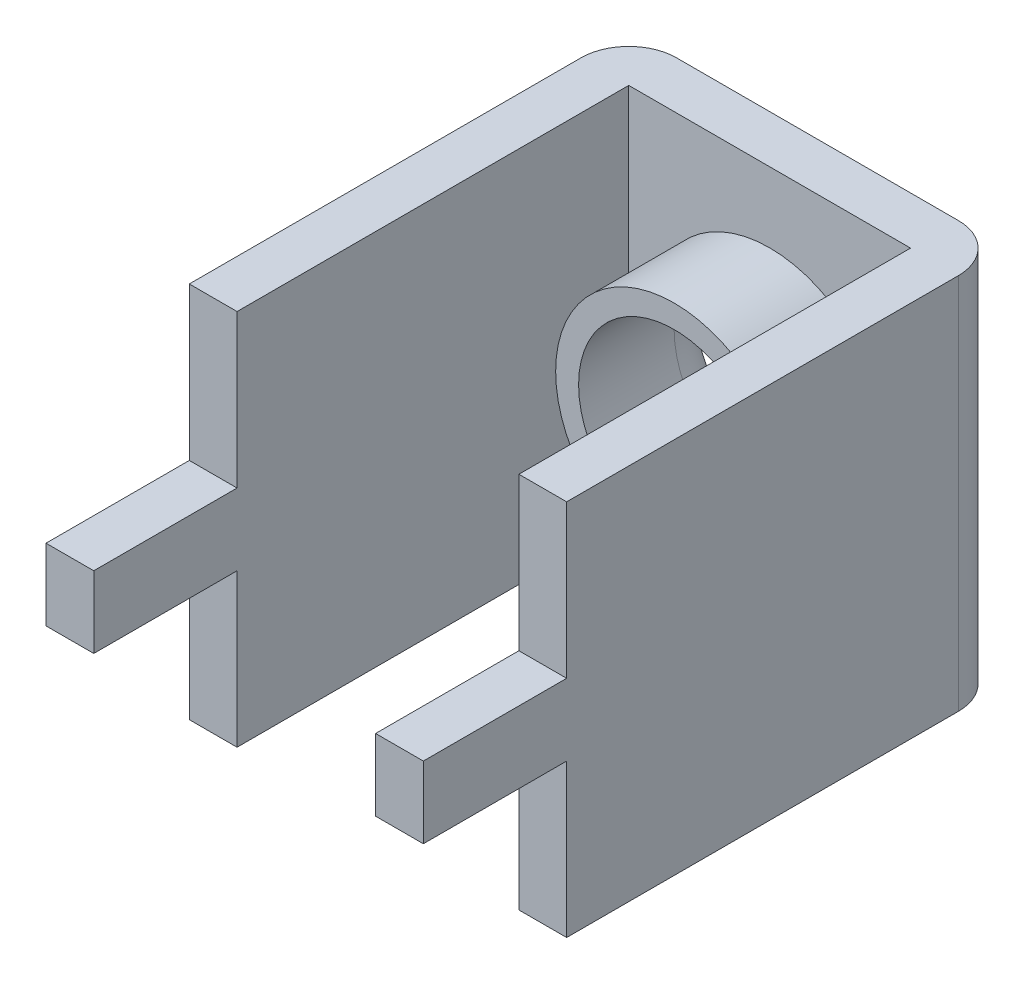
ISO-10303-21;
HEADER;
FILE_DESCRIPTION(('STEP AP214'),'2;1');
FILE_NAME('part.step','',(''),(''),'','','');
FILE_SCHEMA(('AUTOMOTIVE_DESIGN { 1 0 10303 214 1 1 1 1 }'));
ENDSEC;
DATA;
#1=APPLICATION_CONTEXT('core data for automotive mechanical design processes');
#2=APPLICATION_PROTOCOL_DEFINITION('international standard','automotive_design',2000,#1);
#3=PRODUCT_CONTEXT('',#1,'mechanical');
#4=PRODUCT('Part','Part','',(#3));
#5=PRODUCT_RELATED_PRODUCT_CATEGORY('part','',(#4));
#6=PRODUCT_DEFINITION_FORMATION('','',#4);
#7=PRODUCT_DEFINITION_CONTEXT('part definition',#1,'design');
#8=PRODUCT_DEFINITION('design','',#6,#7);
#9=PRODUCT_DEFINITION_SHAPE('','',#8);
#10=(LENGTH_UNIT() NAMED_UNIT(*) SI_UNIT(.MILLI.,.METRE.));
#11=(NAMED_UNIT(*) PLANE_ANGLE_UNIT() SI_UNIT($,.RADIAN.));
#12=(NAMED_UNIT(*) SI_UNIT($,.STERADIAN.) SOLID_ANGLE_UNIT());
#13=UNCERTAINTY_MEASURE_WITH_UNIT(LENGTH_MEASURE(1.E-05),#10,'distance_accuracy_value','');
#14=(GEOMETRIC_REPRESENTATION_CONTEXT(3) GLOBAL_UNCERTAINTY_ASSIGNED_CONTEXT((#13)) GLOBAL_UNIT_ASSIGNED_CONTEXT((#10,
#11,#12)) REPRESENTATION_CONTEXT('',''));
#15=CARTESIAN_POINT('',(0.,0.,0.));
#16=DIRECTION('',(0.,0.,1.));
#17=DIRECTION('',(1.,0.,0.));
#18=AXIS2_PLACEMENT_3D('',#15,#16,#17);
#19=CARTESIAN_POINT('',(0.,0.,0.));
#20=DIRECTION('',(0.,0.,-1.));
#21=DIRECTION('',(-1.,0.,0.));
#22=AXIS2_PLACEMENT_3D('',#19,#20,#21);
#23=PLANE('',#22);
#24=CARTESIAN_POINT('',(0.,0.,0.));
#25=DIRECTION('',(0.,0.,-1.));
#26=DIRECTION('',(-1.,0.,0.));
#27=AXIS2_PLACEMENT_3D('',#24,#25,#26);
#28=CIRCLE('',#27,3.);
#29=CARTESIAN_POINT('',(-2.95,-0.545435605731788,0.));
#30=VERTEX_POINT('',#29);
#31=CARTESIAN_POINT('',(2.95,-0.545435605731779,0.));
#32=VERTEX_POINT('',#31);
#33=EDGE_CURVE('E371',#30,#32,#28,.F.);
#34=ORIENTED_EDGE('',*,*,#33,.T.);
#35=DIRECTION('',(0.,1.,0.));
#36=VECTOR('',#35,1.);
#37=CARTESIAN_POINT('',(2.95,-3.95,0.));
#38=LINE('',#37,#36);
#39=CARTESIAN_POINT('',(2.95,-3.95,0.));
#40=VERTEX_POINT('',#39);
#41=EDGE_CURVE('E375',#32,#40,#38,.F.);
#42=ORIENTED_EDGE('',*,*,#41,.T.);
#43=DIRECTION('',(1.,0.,0.));
#44=VECTOR('',#43,1.);
#45=CARTESIAN_POINT('',(-3.95,-3.95,0.));
#46=LINE('',#45,#44);
#47=CARTESIAN_POINT('',(-2.95,-3.95,0.));
#48=VERTEX_POINT('',#47);
#49=EDGE_CURVE('E336',#48,#40,#46,.T.);
#50=ORIENTED_EDGE('',*,*,#49,.F.);
#51=DIRECTION('',(0.,-1.,0.));
#52=VECTOR('',#51,1.);
#53=CARTESIAN_POINT('',(-2.95,3.95,0.));
#54=LINE('',#53,#52);
#55=EDGE_CURVE('E368',#48,#30,#54,.F.);
#56=ORIENTED_EDGE('',*,*,#55,.T.);
#57=EDGE_LOOP('',(#34,#42,#50,#56));
#58=FACE_BOUND('',#57,.T.);
#59=ADVANCED_FACE('F47',(#58),#23,.T.);
#60=CARTESIAN_POINT('',(0.,0.,1.));
#61=DIRECTION('',(0.,0.,-1.));
#62=DIRECTION('',(-1.,0.,0.));
#63=AXIS2_PLACEMENT_3D('',#60,#61,#62);
#64=PLANE('',#63);
#65=DIRECTION('',(0.,-1.,0.));
#66=VECTOR('',#65,1.);
#67=CARTESIAN_POINT('',(2.95,0.,1.));
#68=LINE('',#67,#66);
#69=CARTESIAN_POINT('',(2.95,3.95,1.));
#70=VERTEX_POINT('',#69);
#71=CARTESIAN_POINT('',(2.95,-3.95,1.));
#72=VERTEX_POINT('',#71);
#73=EDGE_CURVE('E300',#70,#72,#68,.T.);
#74=ORIENTED_EDGE('',*,*,#73,.F.);
#75=DIRECTION('',(-1.,0.,0.));
#76=VECTOR('',#75,1.);
#77=CARTESIAN_POINT('',(-3.95,3.95,1.));
#78=LINE('',#77,#76);
#79=CARTESIAN_POINT('',(-2.95,3.95,1.));
#80=VERTEX_POINT('',#79);
#81=EDGE_CURVE('E332',#70,#80,#78,.T.);
#82=ORIENTED_EDGE('',*,*,#81,.T.);
#83=DIRECTION('',(0.,1.,0.));
#84=VECTOR('',#83,1.);
#85=CARTESIAN_POINT('',(-2.95,0.,1.));
#86=LINE('',#85,#84);
#87=CARTESIAN_POINT('',(-2.95,-3.95,1.));
#88=VERTEX_POINT('',#87);
#89=EDGE_CURVE('E327',#88,#80,#86,.T.);
#90=ORIENTED_EDGE('',*,*,#89,.F.);
#91=DIRECTION('',(1.,0.,0.));
#92=VECTOR('',#91,1.);
#93=CARTESIAN_POINT('',(-3.95,-3.95,1.));
#94=LINE('',#93,#92);
#95=EDGE_CURVE('E335',#88,#72,#94,.T.);
#96=ORIENTED_EDGE('',*,*,#95,.T.);
#97=EDGE_LOOP('',(#74,#82,#90,#96));
#98=FACE_BOUND('',#97,.T.);
#99=CARTESIAN_POINT('',(0.,0.,1.));
#100=DIRECTION('',(0.,0.,-1.));
#101=DIRECTION('',(-1.,0.,0.));
#102=AXIS2_PLACEMENT_3D('',#99,#100,#101);
#103=CIRCLE('',#102,2.48021202687764);
#104=CARTESIAN_POINT('',(-2.48021202687764,0.,1.));
#105=VERTEX_POINT('',#104);
#106=EDGE_CURVE('E355',#105,#105,#103,.F.);
#107=ORIENTED_EDGE('',*,*,#106,.F.);
#108=EDGE_LOOP('',(#107));
#109=FACE_BOUND('',#108,.T.);
#110=ADVANCED_FACE('F422',(#98,#109),#64,.F.);
#111=CARTESIAN_POINT('',(0.,0.,9.2));
#112=DIRECTION('',(0.,0.,-1.));
#113=DIRECTION('',(-1.,0.,0.));
#114=AXIS2_PLACEMENT_3D('',#111,#112,#113);
#115=PLANE('',#114);
#116=DIRECTION('',(-1.,0.,0.));
#117=VECTOR('',#116,1.);
#118=CARTESIAN_POINT('',(3.95,0.750000000000001,9.2));
#119=LINE('',#118,#117);
#120=CARTESIAN_POINT('',(3.95,0.750000000000001,9.2));
#121=VERTEX_POINT('',#120);
#122=CARTESIAN_POINT('',(2.95,0.750000000000002,9.2));
#123=VERTEX_POINT('',#122);
#124=EDGE_CURVE('E209',#121,#123,#119,.T.);
#125=ORIENTED_EDGE('',*,*,#124,.F.);
#126=DIRECTION('',(0.,1.,0.));
#127=VECTOR('',#126,1.);
#128=CARTESIAN_POINT('',(3.95,3.95,9.2));
#129=LINE('',#128,#127);
#130=CARTESIAN_POINT('',(3.95,3.95,9.2));
#131=VERTEX_POINT('',#130);
#132=EDGE_CURVE('E192',#121,#131,#129,.T.);
#133=ORIENTED_EDGE('',*,*,#132,.T.);
#134=DIRECTION('',(-1.,0.,0.));
#135=VECTOR('',#134,1.);
#136=CARTESIAN_POINT('',(3.95,3.95,9.2));
#137=LINE('',#136,#135);
#138=CARTESIAN_POINT('',(2.95,3.95,9.2));
#139=VERTEX_POINT('',#138);
#140=EDGE_CURVE('E206',#131,#139,#137,.T.);
#141=ORIENTED_EDGE('',*,*,#140,.T.);
#142=DIRECTION('',(0.,-1.,0.));
#143=VECTOR('',#142,1.);
#144=CARTESIAN_POINT('',(2.95,3.95,9.2));
#145=LINE('',#144,#143);
#146=EDGE_CURVE('E212',#139,#123,#145,.T.);
#147=ORIENTED_EDGE('',*,*,#146,.T.);
#148=EDGE_LOOP('',(#125,#133,#141,#147));
#149=FACE_BOUND('',#148,.T.);
#150=ADVANCED_FACE('F210',(#149),#115,.F.);
#151=DIRECTION('',(1.,0.,0.));
#152=VECTOR('',#151,1.);
#153=CARTESIAN_POINT('',(2.95,-0.75,9.2));
#154=LINE('',#153,#152);
#155=CARTESIAN_POINT('',(2.95,-0.749999999999999,9.2));
#156=VERTEX_POINT('',#155);
#157=CARTESIAN_POINT('',(3.95,-0.749999999999999,9.2));
#158=VERTEX_POINT('',#157);
#159=EDGE_CURVE('E218',#156,#158,#154,.T.);
#160=ORIENTED_EDGE('',*,*,#159,.F.);
#161=CARTESIAN_POINT('',(2.95,-3.95,9.2));
#162=VERTEX_POINT('',#161);
#163=EDGE_CURVE('E294',#156,#162,#145,.T.);
#164=ORIENTED_EDGE('',*,*,#163,.T.);
#165=DIRECTION('',(1.,0.,0.));
#166=VECTOR('',#165,1.);
#167=CARTESIAN_POINT('',(3.95,-3.95,9.2));
#168=LINE('',#167,#166);
#169=CARTESIAN_POINT('',(3.95,-3.95,9.2));
#170=VERTEX_POINT('',#169);
#171=EDGE_CURVE('E290',#162,#170,#168,.T.);
#172=ORIENTED_EDGE('',*,*,#171,.T.);
#173=EDGE_CURVE('E205',#170,#158,#129,.T.);
#174=ORIENTED_EDGE('',*,*,#173,.T.);
#175=EDGE_LOOP('',(#160,#164,#172,#174));
#176=FACE_BOUND('',#175,.T.);
#177=ADVANCED_FACE('F540',(#176),#115,.F.);
#178=CARTESIAN_POINT('',(0.,0.,9.2));
#179=DIRECTION('',(0.,0.,1.));
#180=DIRECTION('',(1.,0.,0.));
#181=AXIS2_PLACEMENT_3D('',#178,#179,#180);
#182=PLANE('',#181);
#183=DIRECTION('',(0.,-1.,0.));
#184=VECTOR('',#183,1.);
#185=CARTESIAN_POINT('',(-3.95,3.95,9.2));
#186=LINE('',#185,#184);
#187=CARTESIAN_POINT('',(-3.95,3.95,9.2));
#188=VERTEX_POINT('',#187);
#189=CARTESIAN_POINT('',(-3.95,0.750000000000001,9.2));
#190=VERTEX_POINT('',#189);
#191=EDGE_CURVE('E305',#188,#190,#186,.T.);
#192=ORIENTED_EDGE('',*,*,#191,.T.);
#193=DIRECTION('',(-1.,0.,0.));
#194=VECTOR('',#193,1.);
#195=CARTESIAN_POINT('',(-3.95,0.75,9.2));
#196=LINE('',#195,#194);
#197=CARTESIAN_POINT('',(-2.95,0.75,9.2));
#198=VERTEX_POINT('',#197);
#199=EDGE_CURVE('E217',#198,#190,#196,.T.);
#200=ORIENTED_EDGE('',*,*,#199,.F.);
#201=DIRECTION('',(0.,1.,0.));
#202=VECTOR('',#201,1.);
#203=CARTESIAN_POINT('',(-2.95,3.95,9.2));
#204=LINE('',#203,#202);
#205=CARTESIAN_POINT('',(-2.95,3.95,9.2));
#206=VERTEX_POINT('',#205);
#207=EDGE_CURVE('E311',#198,#206,#204,.T.);
#208=ORIENTED_EDGE('',*,*,#207,.T.);
#209=DIRECTION('',(-1.,0.,0.));
#210=VECTOR('',#209,1.);
#211=CARTESIAN_POINT('',(-3.95,3.95,9.2));
#212=LINE('',#211,#210);
#213=EDGE_CURVE('E315',#206,#188,#212,.T.);
#214=ORIENTED_EDGE('',*,*,#213,.T.);
#215=EDGE_LOOP('',(#192,#200,#208,#214));
#216=FACE_BOUND('',#215,.T.);
#217=ADVANCED_FACE('F440',(#216),#182,.T.);
#218=CARTESIAN_POINT('',(-2.95,-3.95,9.2));
#219=VERTEX_POINT('',#218);
#220=CARTESIAN_POINT('',(-2.95,-0.75,9.2));
#221=VERTEX_POINT('',#220);
#222=EDGE_CURVE('E312',#219,#221,#204,.T.);
#223=ORIENTED_EDGE('',*,*,#222,.T.);
#224=DIRECTION('',(1.,0.,0.));
#225=VECTOR('',#224,1.);
#226=CARTESIAN_POINT('',(-2.95,-0.75,9.2));
#227=LINE('',#226,#225);
#228=CARTESIAN_POINT('',(-3.95,-0.75,9.2));
#229=VERTEX_POINT('',#228);
#230=EDGE_CURVE('E251',#229,#221,#227,.T.);
#231=ORIENTED_EDGE('',*,*,#230,.F.);
#232=CARTESIAN_POINT('',(-3.95,-3.95,9.2));
#233=VERTEX_POINT('',#232);
#234=EDGE_CURVE('E304',#229,#233,#186,.T.);
#235=ORIENTED_EDGE('',*,*,#234,.T.);
#236=DIRECTION('',(1.,0.,0.));
#237=VECTOR('',#236,1.);
#238=CARTESIAN_POINT('',(-3.95,-3.95,9.2));
#239=LINE('',#238,#237);
#240=EDGE_CURVE('E308',#233,#219,#239,.T.);
#241=ORIENTED_EDGE('',*,*,#240,.T.);
#242=EDGE_LOOP('',(#223,#231,#235,#241));
#243=FACE_BOUND('',#242,.T.);
#244=ADVANCED_FACE('F433',(#243),#182,.T.);
#245=DIRECTION('',(-1.,0.,0.));
#246=VECTOR('',#245,1.);
#247=CARTESIAN_POINT('',(-3.95,3.95,0.));
#248=LINE('',#247,#246);
#249=CARTESIAN_POINT('',(2.95,3.95,0.));
#250=VERTEX_POINT('',#249);
#251=CARTESIAN_POINT('',(-2.95,3.95,0.));
#252=VERTEX_POINT('',#251);
#253=EDGE_CURVE('E331',#250,#252,#248,.T.);
#254=ORIENTED_EDGE('',*,*,#253,.F.);
#255=DIRECTION('',(0.,1.,0.));
#256=VECTOR('',#255,1.);
#257=CARTESIAN_POINT('',(2.95,-3.95,0.));
#258=LINE('',#257,#256);
#259=CARTESIAN_POINT('',(2.95,0.545435605731781,0.));
#260=VERTEX_POINT('',#259);
#261=EDGE_CURVE('E365',#250,#260,#258,.F.);
#262=ORIENTED_EDGE('',*,*,#261,.T.);
#263=CARTESIAN_POINT('',(0.,0.,0.));
#264=DIRECTION('',(0.,0.,-1.));
#265=DIRECTION('',(-1.,0.,0.));
#266=AXIS2_PLACEMENT_3D('',#263,#264,#265);
#267=CIRCLE('',#266,3.);
#268=CARTESIAN_POINT('',(-2.95,0.54543560573179,0.));
#269=VERTEX_POINT('',#268);
#270=EDGE_CURVE('E362',#260,#269,#267,.F.);
#271=ORIENTED_EDGE('',*,*,#270,.T.);
#272=DIRECTION('',(0.,-1.,0.));
#273=VECTOR('',#272,1.);
#274=CARTESIAN_POINT('',(-2.95,3.95,0.));
#275=LINE('',#274,#273);
#276=EDGE_CURVE('E359',#269,#252,#275,.F.);
#277=ORIENTED_EDGE('',*,*,#276,.T.);
#278=EDGE_LOOP('',(#254,#262,#271,#277));
#279=FACE_BOUND('',#278,.T.);
#280=ADVANCED_FACE('F425',(#279),#23,.T.);
#281=CARTESIAN_POINT('',(3.95,-3.95,1.));
#282=DIRECTION('',(-1.,0.,0.));
#283=DIRECTION('',(0.,0.,1.));
#284=AXIS2_PLACEMENT_3D('',#281,#282,#283);
#285=PLANE('',#284);
#286=DIRECTION('',(0.,0.,-1.));
#287=VECTOR('',#286,1.);
#288=CARTESIAN_POINT('',(3.95,-3.95,1.));
#289=LINE('',#288,#287);
#290=CARTESIAN_POINT('',(3.95,-3.95,1.));
#291=VERTEX_POINT('',#290);
#292=EDGE_CURVE('E339',#170,#291,#289,.T.);
#293=ORIENTED_EDGE('',*,*,#292,.T.);
#294=DIRECTION('',(0.,1.,0.));
#295=VECTOR('',#294,1.);
#296=CARTESIAN_POINT('',(3.95,3.95,1.));
#297=LINE('',#296,#295);
#298=CARTESIAN_POINT('',(3.95,3.95,1.));
#299=VERTEX_POINT('',#298);
#300=EDGE_CURVE('E382',#291,#299,#297,.T.);
#301=ORIENTED_EDGE('',*,*,#300,.T.);
#302=DIRECTION('',(0.,0.,-1.));
#303=VECTOR('',#302,1.);
#304=CARTESIAN_POINT('',(3.95,3.95,1.));
#305=LINE('',#304,#303);
#306=EDGE_CURVE('E201',#131,#299,#305,.T.);
#307=ORIENTED_EDGE('',*,*,#306,.F.);
#308=ORIENTED_EDGE('',*,*,#132,.F.);
#309=DIRECTION('',(0.,0.,-1.));
#310=VECTOR('',#309,1.);
#311=CARTESIAN_POINT('',(3.95,0.750000000000001,12.2));
#312=LINE('',#311,#310);
#313=CARTESIAN_POINT('',(3.95,0.750000000000001,12.2));
#314=VERTEX_POINT('',#313);
#315=EDGE_CURVE('E198',#314,#121,#312,.T.);
#316=ORIENTED_EDGE('',*,*,#315,.F.);
#317=DIRECTION('',(0.,1.,0.));
#318=VECTOR('',#317,1.);
#319=CARTESIAN_POINT('',(3.95,-0.749999999999999,12.2));
#320=LINE('',#319,#318);
#321=CARTESIAN_POINT('',(3.95,-0.749999999999999,12.2));
#322=VERTEX_POINT('',#321);
#323=EDGE_CURVE('E224',#322,#314,#320,.T.);
#324=ORIENTED_EDGE('',*,*,#323,.F.);
#325=DIRECTION('',(0.,0.,-1.));
#326=VECTOR('',#325,1.);
#327=CARTESIAN_POINT('',(3.95,-0.749999999999999,12.2));
#328=LINE('',#327,#326);
#329=EDGE_CURVE('E225',#322,#158,#328,.T.);
#330=ORIENTED_EDGE('',*,*,#329,.T.);
#331=ORIENTED_EDGE('',*,*,#173,.F.);
#332=EDGE_LOOP('',(#293,#301,#307,#308,#316,#324,#330,#331));
#333=FACE_BOUND('',#332,.T.);
#334=ADVANCED_FACE('F195',(#333),#285,.F.);
#335=CARTESIAN_POINT('',(-3.95,3.95,1.));
#336=DIRECTION('',(0.,-1.,0.));
#337=DIRECTION('',(0.,0.,-1.));
#338=AXIS2_PLACEMENT_3D('',#335,#336,#337);
#339=PLANE('',#338);
#340=ORIENTED_EDGE('',*,*,#306,.T.);
#341=CARTESIAN_POINT('',(2.95,3.95,1.));
#342=DIRECTION('',(0.,-1.,0.));
#343=DIRECTION('',(0.,0.,-1.));
#344=AXIS2_PLACEMENT_3D('',#341,#342,#343);
#345=CIRCLE('',#344,1.);
#346=EDGE_CURVE('E387',#299,#250,#345,.F.);
#347=ORIENTED_EDGE('',*,*,#346,.T.);
#348=ORIENTED_EDGE('',*,*,#253,.T.);
#349=CARTESIAN_POINT('',(-2.95,3.95,1.));
#350=DIRECTION('',(0.,-1.,0.));
#351=DIRECTION('',(0.,0.,-1.));
#352=AXIS2_PLACEMENT_3D('',#349,#350,#351);
#353=CIRCLE('',#352,1.);
#354=CARTESIAN_POINT('',(-3.95,3.95,1.));
#355=VERTEX_POINT('',#354);
#356=EDGE_CURVE('E76',#252,#355,#353,.F.);
#357=ORIENTED_EDGE('',*,*,#356,.T.);
#358=DIRECTION('',(0.,0.,-1.));
#359=VECTOR('',#358,1.);
#360=CARTESIAN_POINT('',(-3.95,3.95,1.));
#361=LINE('',#360,#359);
#362=EDGE_CURVE('E350',#188,#355,#361,.T.);
#363=ORIENTED_EDGE('',*,*,#362,.F.);
#364=ORIENTED_EDGE('',*,*,#213,.F.);
#365=DIRECTION('',(0.,0.,-1.));
#366=VECTOR('',#365,1.);
#367=CARTESIAN_POINT('',(-2.95,3.95,9.2));
#368=LINE('',#367,#366);
#369=EDGE_CURVE('E319',#206,#80,#368,.T.);
#370=ORIENTED_EDGE('',*,*,#369,.T.);
#371=ORIENTED_EDGE('',*,*,#81,.F.);
#372=DIRECTION('',(0.,0.,-1.));
#373=VECTOR('',#372,1.);
#374=CARTESIAN_POINT('',(2.95,3.95,9.2));
#375=LINE('',#374,#373);
#376=EDGE_CURVE('E282',#139,#70,#375,.T.);
#377=ORIENTED_EDGE('',*,*,#376,.F.);
#378=ORIENTED_EDGE('',*,*,#140,.F.);
#379=EDGE_LOOP('',(#340,#347,#348,#357,#363,#364,#370,#371,#377,#378));
#380=FACE_BOUND('',#379,.T.);
#381=ADVANCED_FACE('F438',(#380),#339,.F.);
#382=CARTESIAN_POINT('',(-3.95,-3.95,1.));
#383=DIRECTION('',(1.,0.,0.));
#384=DIRECTION('',(0.,0.,-1.));
#385=AXIS2_PLACEMENT_3D('',#382,#383,#384);
#386=PLANE('',#385);
#387=ORIENTED_EDGE('',*,*,#362,.T.);
#388=DIRECTION('',(0.,-1.,0.));
#389=VECTOR('',#388,1.);
#390=CARTESIAN_POINT('',(-3.95,-3.95,1.));
#391=LINE('',#390,#389);
#392=CARTESIAN_POINT('',(-3.95,-3.95,1.));
#393=VERTEX_POINT('',#392);
#394=EDGE_CURVE('E11',#355,#393,#391,.T.);
#395=ORIENTED_EDGE('',*,*,#394,.T.);
#396=DIRECTION('',(0.,0.,-1.));
#397=VECTOR('',#396,1.);
#398=CARTESIAN_POINT('',(-3.95,-3.95,1.));
#399=LINE('',#398,#397);
#400=EDGE_CURVE('E347',#233,#393,#399,.T.);
#401=ORIENTED_EDGE('',*,*,#400,.F.);
#402=ORIENTED_EDGE('',*,*,#234,.F.);
#403=DIRECTION('',(0.,0.,-1.));
#404=VECTOR('',#403,1.);
#405=CARTESIAN_POINT('',(-3.95,-0.75,12.2));
#406=LINE('',#405,#404);
#407=CARTESIAN_POINT('',(-3.95,-0.75,12.2));
#408=VERTEX_POINT('',#407);
#409=EDGE_CURVE('E274',#408,#229,#406,.T.);
#410=ORIENTED_EDGE('',*,*,#409,.F.);
#411=DIRECTION('',(0.,-1.,0.));
#412=VECTOR('',#411,1.);
#413=CARTESIAN_POINT('',(-3.95,-0.75,12.2));
#414=LINE('',#413,#412);
#415=CARTESIAN_POINT('',(-3.95,0.75,12.2));
#416=VERTEX_POINT('',#415);
#417=EDGE_CURVE('E250',#416,#408,#414,.T.);
#418=ORIENTED_EDGE('',*,*,#417,.F.);
#419=DIRECTION('',(0.,0.,-1.));
#420=VECTOR('',#419,1.);
#421=CARTESIAN_POINT('',(-3.95,0.75,12.2));
#422=LINE('',#421,#420);
#423=EDGE_CURVE('E278',#416,#190,#422,.T.);
#424=ORIENTED_EDGE('',*,*,#423,.T.);
#425=ORIENTED_EDGE('',*,*,#191,.F.);
#426=EDGE_LOOP('',(#387,#395,#401,#402,#410,#418,#424,#425));
#427=FACE_BOUND('',#426,.T.);
#428=ADVANCED_FACE('F464',(#427),#386,.F.);
#429=CARTESIAN_POINT('',(-3.95,-3.95,1.));
#430=DIRECTION('',(0.,1.,0.));
#431=DIRECTION('',(0.,0.,1.));
#432=AXIS2_PLACEMENT_3D('',#429,#430,#431);
#433=PLANE('',#432);
#434=ORIENTED_EDGE('',*,*,#49,.T.);
#435=CARTESIAN_POINT('',(2.95,-3.95,1.));
#436=DIRECTION('',(0.,1.,0.));
#437=DIRECTION('',(0.,0.,1.));
#438=AXIS2_PLACEMENT_3D('',#435,#436,#437);
#439=CIRCLE('',#438,1.);
#440=EDGE_CURVE('E62',#40,#291,#439,.F.);
#441=ORIENTED_EDGE('',*,*,#440,.T.);
#442=ORIENTED_EDGE('',*,*,#292,.F.);
#443=ORIENTED_EDGE('',*,*,#171,.F.);
#444=DIRECTION('',(0.,0.,-1.));
#445=VECTOR('',#444,1.);
#446=CARTESIAN_POINT('',(2.95,-3.95,9.2));
#447=LINE('',#446,#445);
#448=EDGE_CURVE('E286',#162,#72,#447,.T.);
#449=ORIENTED_EDGE('',*,*,#448,.T.);
#450=ORIENTED_EDGE('',*,*,#95,.F.);
#451=DIRECTION('',(0.,0.,-1.));
#452=VECTOR('',#451,1.);
#453=CARTESIAN_POINT('',(-2.95,-3.95,9.2));
#454=LINE('',#453,#452);
#455=EDGE_CURVE('E323',#219,#88,#454,.T.);
#456=ORIENTED_EDGE('',*,*,#455,.F.);
#457=ORIENTED_EDGE('',*,*,#240,.F.);
#458=ORIENTED_EDGE('',*,*,#400,.T.);
#459=CARTESIAN_POINT('',(-2.95,-3.95,1.));
#460=DIRECTION('',(0.,1.,0.));
#461=DIRECTION('',(0.,0.,1.));
#462=AXIS2_PLACEMENT_3D('',#459,#460,#461);
#463=CIRCLE('',#462,1.);
#464=EDGE_CURVE('E390',#393,#48,#463,.F.);
#465=ORIENTED_EDGE('',*,*,#464,.T.);
#466=EDGE_LOOP('',(#434,#441,#442,#443,#449,#450,#456,#457,#458,#465));
#467=FACE_BOUND('',#466,.T.);
#468=ADVANCED_FACE('F460',(#467),#433,.F.);
#469=CARTESIAN_POINT('',(0.,0.,1.));
#470=DIRECTION('',(0.,0.,-1.));
#471=DIRECTION('',(-1.,0.,0.));
#472=AXIS2_PLACEMENT_3D('',#469,#470,#471);
#473=CYLINDRICAL_SURFACE('',#472,2.);
#474=CARTESIAN_POINT('',(0.,0.,1.));
#475=DIRECTION('',(0.,0.,-1.));
#476=DIRECTION('',(-1.,0.,0.));
#477=AXIS2_PLACEMENT_3D('',#474,#475,#476);
#478=CIRCLE('',#477,2.);
#479=CARTESIAN_POINT('',(-2.,0.,1.));
#480=VERTEX_POINT('',#479);
#481=EDGE_CURVE('E378',#480,#480,#478,.T.);
#482=ORIENTED_EDGE('',*,*,#481,.T.);
#483=EDGE_LOOP('',(#482));
#484=FACE_BOUND('',#483,.T.);
#485=CARTESIAN_POINT('',(0.,0.,3.));
#486=DIRECTION('',(0.,0.,1.));
#487=DIRECTION('',(1.,0.,0.));
#488=AXIS2_PLACEMENT_3D('',#485,#486,#487);
#489=CIRCLE('',#488,2.);
#490=CARTESIAN_POINT('',(2.,0.,3.));
#491=VERTEX_POINT('',#490);
#492=EDGE_CURVE('E505',#491,#491,#489,.T.);
#493=ORIENTED_EDGE('',*,*,#492,.T.);
#494=EDGE_LOOP('',(#493));
#495=FACE_BOUND('',#494,.T.);
#496=ADVANCED_FACE('F513',(#484,#495),#473,.F.);
#497=CARTESIAN_POINT('',(-2.95,3.95,9.2));
#498=DIRECTION('',(-1.,0.,0.));
#499=DIRECTION('',(0.,-1.,0.));
#500=AXIS2_PLACEMENT_3D('',#497,#498,#499);
#501=PLANE('',#500);
#502=ORIENTED_EDGE('',*,*,#455,.T.);
#503=ORIENTED_EDGE('',*,*,#89,.T.);
#504=ORIENTED_EDGE('',*,*,#369,.F.);
#505=ORIENTED_EDGE('',*,*,#207,.F.);
#506=DIRECTION('',(0.,0.,-1.));
#507=VECTOR('',#506,1.);
#508=CARTESIAN_POINT('',(-2.95,0.75,12.2));
#509=LINE('',#508,#507);
#510=CARTESIAN_POINT('',(-2.95,0.75,12.2));
#511=VERTEX_POINT('',#510);
#512=EDGE_CURVE('E260',#511,#198,#509,.T.);
#513=ORIENTED_EDGE('',*,*,#512,.F.);
#514=DIRECTION('',(0.,1.,0.));
#515=VECTOR('',#514,1.);
#516=CARTESIAN_POINT('',(-2.95,0.75,12.2));
#517=LINE('',#516,#515);
#518=CARTESIAN_POINT('',(-2.95,-0.75,12.2));
#519=VERTEX_POINT('',#518);
#520=EDGE_CURVE('E257',#519,#511,#517,.T.);
#521=ORIENTED_EDGE('',*,*,#520,.F.);
#522=DIRECTION('',(0.,0.,-1.));
#523=VECTOR('',#522,1.);
#524=CARTESIAN_POINT('',(-2.95,-0.75,12.2));
#525=LINE('',#524,#523);
#526=EDGE_CURVE('E270',#519,#221,#525,.T.);
#527=ORIENTED_EDGE('',*,*,#526,.T.);
#528=ORIENTED_EDGE('',*,*,#222,.F.);
#529=EDGE_LOOP('',(#502,#503,#504,#505,#513,#521,#527,#528));
#530=FACE_BOUND('',#529,.T.);
#531=ADVANCED_FACE('F487',(#530),#501,.F.);
#532=CARTESIAN_POINT('',(2.95,3.95,9.2));
#533=DIRECTION('',(1.,0.,0.));
#534=DIRECTION('',(0.,1.,0.));
#535=AXIS2_PLACEMENT_3D('',#532,#533,#534);
#536=PLANE('',#535);
#537=ORIENTED_EDGE('',*,*,#376,.T.);
#538=ORIENTED_EDGE('',*,*,#73,.T.);
#539=ORIENTED_EDGE('',*,*,#448,.F.);
#540=ORIENTED_EDGE('',*,*,#163,.F.);
#541=DIRECTION('',(0.,0.,-1.));
#542=VECTOR('',#541,1.);
#543=CARTESIAN_POINT('',(2.95,-0.75,12.2));
#544=LINE('',#543,#542);
#545=CARTESIAN_POINT('',(2.95,-0.75,12.2));
#546=VERTEX_POINT('',#545);
#547=EDGE_CURVE('E232',#546,#156,#544,.T.);
#548=ORIENTED_EDGE('',*,*,#547,.F.);
#549=DIRECTION('',(0.,-1.,0.));
#550=VECTOR('',#549,1.);
#551=CARTESIAN_POINT('',(2.95,0.750000000000001,12.2));
#552=LINE('',#551,#550);
#553=CARTESIAN_POINT('',(2.95,0.750000000000001,12.2));
#554=VERTEX_POINT('',#553);
#555=EDGE_CURVE('E241',#554,#546,#552,.T.);
#556=ORIENTED_EDGE('',*,*,#555,.F.);
#557=DIRECTION('',(0.,0.,-1.));
#558=VECTOR('',#557,1.);
#559=CARTESIAN_POINT('',(2.95,0.750000000000001,12.2));
#560=LINE('',#559,#558);
#561=EDGE_CURVE('E498',#554,#123,#560,.T.);
#562=ORIENTED_EDGE('',*,*,#561,.T.);
#563=ORIENTED_EDGE('',*,*,#146,.F.);
#564=EDGE_LOOP('',(#537,#538,#539,#540,#548,#556,#562,#563));
#565=FACE_BOUND('',#564,.T.);
#566=ADVANCED_FACE('F495',(#565),#536,.F.);
#567=CARTESIAN_POINT('',(-3.95,0.75,12.2));
#568=DIRECTION('',(0.,-1.,0.));
#569=DIRECTION('',(0.,0.,-1.));
#570=AXIS2_PLACEMENT_3D('',#567,#568,#569);
#571=PLANE('',#570);
#572=ORIENTED_EDGE('',*,*,#199,.T.);
#573=ORIENTED_EDGE('',*,*,#423,.F.);
#574=DIRECTION('',(-1.,0.,0.));
#575=VECTOR('',#574,1.);
#576=CARTESIAN_POINT('',(-3.95,0.75,12.2));
#577=LINE('',#576,#575);
#578=EDGE_CURVE('E246',#511,#416,#577,.T.);
#579=ORIENTED_EDGE('',*,*,#578,.F.);
#580=ORIENTED_EDGE('',*,*,#512,.T.);
#581=EDGE_LOOP('',(#572,#573,#579,#580));
#582=FACE_BOUND('',#581,.T.);
#583=ADVANCED_FACE('F480',(#582),#571,.F.);
#584=CARTESIAN_POINT('',(-2.95,-0.75,12.2));
#585=DIRECTION('',(0.,1.,0.));
#586=DIRECTION('',(-1.,0.,0.));
#587=AXIS2_PLACEMENT_3D('',#584,#585,#586);
#588=PLANE('',#587);
#589=ORIENTED_EDGE('',*,*,#230,.T.);
#590=ORIENTED_EDGE('',*,*,#526,.F.);
#591=DIRECTION('',(1.,0.,0.));
#592=VECTOR('',#591,1.);
#593=CARTESIAN_POINT('',(-2.95,-0.75,12.2));
#594=LINE('',#593,#592);
#595=EDGE_CURVE('E254',#408,#519,#594,.T.);
#596=ORIENTED_EDGE('',*,*,#595,.F.);
#597=ORIENTED_EDGE('',*,*,#409,.T.);
#598=EDGE_LOOP('',(#589,#590,#596,#597));
#599=FACE_BOUND('',#598,.T.);
#600=ADVANCED_FACE('F469',(#599),#588,.F.);
#601=CARTESIAN_POINT('',(0.,0.,12.2));
#602=DIRECTION('',(0.,0.,-1.));
#603=DIRECTION('',(-1.,0.,0.));
#604=AXIS2_PLACEMENT_3D('',#601,#602,#603);
#605=PLANE('',#604);
#606=ORIENTED_EDGE('',*,*,#578,.T.);
#607=ORIENTED_EDGE('',*,*,#417,.T.);
#608=ORIENTED_EDGE('',*,*,#595,.T.);
#609=ORIENTED_EDGE('',*,*,#520,.T.);
#610=EDGE_LOOP('',(#606,#607,#608,#609));
#611=FACE_BOUND('',#610,.T.);
#612=ADVANCED_FACE('F473',(#611),#605,.F.);
#613=CARTESIAN_POINT('',(3.95,0.750000000000001,12.2));
#614=DIRECTION('',(0.,-1.,0.));
#615=DIRECTION('',(0.,0.,-1.));
#616=AXIS2_PLACEMENT_3D('',#613,#614,#615);
#617=PLANE('',#616);
#618=ORIENTED_EDGE('',*,*,#124,.T.);
#619=ORIENTED_EDGE('',*,*,#561,.F.);
#620=DIRECTION('',(-1.,0.,0.));
#621=VECTOR('',#620,1.);
#622=CARTESIAN_POINT('',(3.95,0.750000000000001,12.2));
#623=LINE('',#622,#621);
#624=EDGE_CURVE('E222',#314,#554,#623,.T.);
#625=ORIENTED_EDGE('',*,*,#624,.F.);
#626=ORIENTED_EDGE('',*,*,#315,.T.);
#627=EDGE_LOOP('',(#618,#619,#625,#626));
#628=FACE_BOUND('',#627,.T.);
#629=ADVANCED_FACE('F220',(#628),#617,.F.);
#630=CARTESIAN_POINT('',(2.95,-0.75,12.2));
#631=DIRECTION('',(0.,1.,0.));
#632=DIRECTION('',(-1.,0.,0.));
#633=AXIS2_PLACEMENT_3D('',#630,#631,#632);
#634=PLANE('',#633);
#635=ORIENTED_EDGE('',*,*,#159,.T.);
#636=ORIENTED_EDGE('',*,*,#329,.F.);
#637=DIRECTION('',(1.,0.,0.));
#638=VECTOR('',#637,1.);
#639=CARTESIAN_POINT('',(2.95,-0.75,12.2));
#640=LINE('',#639,#638);
#641=EDGE_CURVE('E229',#546,#322,#640,.T.);
#642=ORIENTED_EDGE('',*,*,#641,.F.);
#643=ORIENTED_EDGE('',*,*,#547,.T.);
#644=EDGE_LOOP('',(#635,#636,#642,#643));
#645=FACE_BOUND('',#644,.T.);
#646=ADVANCED_FACE('F522',(#645),#634,.F.);
#647=CARTESIAN_POINT('',(0.,0.,12.2));
#648=DIRECTION('',(0.,0.,1.));
#649=DIRECTION('',(1.,0.,0.));
#650=AXIS2_PLACEMENT_3D('',#647,#648,#649);
#651=PLANE('',#650);
#652=ORIENTED_EDGE('',*,*,#624,.T.);
#653=ORIENTED_EDGE('',*,*,#555,.T.);
#654=ORIENTED_EDGE('',*,*,#641,.T.);
#655=ORIENTED_EDGE('',*,*,#323,.T.);
#656=EDGE_LOOP('',(#652,#653,#654,#655));
#657=FACE_BOUND('',#656,.T.);
#658=ADVANCED_FACE('F516',(#657),#651,.T.);
#659=CARTESIAN_POINT('',(0.,0.,3.));
#660=DIRECTION('',(0.,0.,1.));
#661=DIRECTION('',(1.,0.,0.));
#662=AXIS2_PLACEMENT_3D('',#659,#660,#661);
#663=PLANE('',#662);
#664=CARTESIAN_POINT('',(0.,0.,3.));
#665=DIRECTION('',(0.,0.,1.));
#666=DIRECTION('',(1.,0.,0.));
#667=AXIS2_PLACEMENT_3D('',#664,#665,#666);
#668=CIRCLE('',#667,2.48021202687764);
#669=CARTESIAN_POINT('',(2.48021202687764,0.,3.));
#670=VERTEX_POINT('',#669);
#671=EDGE_CURVE('E500',#670,#670,#668,.T.);
#672=ORIENTED_EDGE('',*,*,#671,.T.);
#673=EDGE_LOOP('',(#672));
#674=FACE_BOUND('',#673,.T.);
#675=ORIENTED_EDGE('',*,*,#492,.F.);
#676=EDGE_LOOP('',(#675));
#677=FACE_BOUND('',#676,.T.);
#678=ADVANCED_FACE('F418',(#674,#677),#663,.T.);
#679=CARTESIAN_POINT('',(0.,0.,3.));
#680=DIRECTION('',(0.,0.,-1.));
#681=DIRECTION('',(-1.,0.,0.));
#682=AXIS2_PLACEMENT_3D('',#679,#680,#681);
#683=CYLINDRICAL_SURFACE('',#682,2.48021202687764);
#684=ORIENTED_EDGE('',*,*,#671,.F.);
#685=EDGE_LOOP('',(#684));
#686=FACE_BOUND('',#685,.T.);
#687=ORIENTED_EDGE('',*,*,#106,.T.);
#688=EDGE_LOOP('',(#687));
#689=FACE_BOUND('',#688,.T.);
#690=ADVANCED_FACE('F412',(#686,#689),#683,.T.);
#691=CARTESIAN_POINT('',(-2.95,-3.95,1.));
#692=DIRECTION('',(0.,1.,0.));
#693=DIRECTION('',(0.,0.,1.));
#694=AXIS2_PLACEMENT_3D('',#691,#692,#693);
#695=CYLINDRICAL_SURFACE('',#694,1.);
#696=ORIENTED_EDGE('',*,*,#356,.F.);
#697=ORIENTED_EDGE('',*,*,#276,.F.);
#698=CARTESIAN_POINT('',(-2.95,-0.545435605731788,0.));
#699=CARTESIAN_POINT('',(-2.95045135637653,-0.540512097382101,7.49685640711346E-08));
#700=CARTESIAN_POINT('',(-2.95089663894288,-0.535587961865416,3.76503715942267E-07));
#701=CARTESIAN_POINT('',(-2.96706477459429,-0.354297144812319,1.93619311132422E-05));
#702=CARTESIAN_POINT('',(-2.97499999984781,-0.177148572400717,0.000312548849668291));
#703=CARTESIAN_POINT('',(-2.9750000001522,0.177148572447901,0.000312548837110167));
#704=CARTESIAN_POINT('',(-2.96706477520548,0.354297144884916,1.93619060861075E-05));
#705=CARTESIAN_POINT('',(-2.95089663897696,0.535587961862519,3.76502299384168E-07));
#706=CARTESIAN_POINT('',(-2.95045135639392,0.540512097380696,7.49678164684707E-08));
#707=CARTESIAN_POINT('',(-2.95,0.54543560573179,0.));
#708=B_SPLINE_CURVE_WITH_KNOTS('',3,(#698,#699,#700,#701,#702,#703,#704,#705,#706,#707),
.UNSPECIFIED.,.F.,.F.,(4,2,2,2,4),(0.,0.0148326657606347,0.546023345711483,1.0772140255816,
1.0920466913512),.UNSPECIFIED.);
#709=EDGE_CURVE('E51',#30,#269,#708,.T.);
#710=ORIENTED_EDGE('',*,*,#709,.F.);
#711=ORIENTED_EDGE('',*,*,#55,.F.);
#712=ORIENTED_EDGE('',*,*,#464,.F.);
#713=ORIENTED_EDGE('',*,*,#394,.F.);
#714=EDGE_LOOP('',(#696,#697,#710,#711,#712,#713));
#715=FACE_BOUND('',#714,.T.);
#716=ADVANCED_FACE('F407',(#715),#695,.T.);
#717=CARTESIAN_POINT('',(2.95,-3.95,1.));
#718=DIRECTION('',(0.,-1.,0.));
#719=DIRECTION('',(0.,0.,-1.));
#720=AXIS2_PLACEMENT_3D('',#717,#718,#719);
#721=CYLINDRICAL_SURFACE('',#720,1.);
#722=ORIENTED_EDGE('',*,*,#440,.F.);
#723=ORIENTED_EDGE('',*,*,#41,.F.);
#724=CARTESIAN_POINT('',(2.95,0.545435605731779,0.));
#725=CARTESIAN_POINT('',(2.95045135637656,0.540512097382094,7.49685249823962E-08));
#726=CARTESIAN_POINT('',(2.95089663894294,0.535587961865412,3.76503696749419E-07));
#727=CARTESIAN_POINT('',(2.96706477459538,0.354297144812429,1.93619317962475E-05));
#728=CARTESIAN_POINT('',(2.97499999984803,0.177148572400783,0.000312548849981818));
#729=CARTESIAN_POINT('',(2.97500000015198,-0.177148572447887,0.00031254883679667));
#730=CARTESIAN_POINT('',(2.96706477520569,-0.35429714488491,1.93619055149374E-05));
#731=CARTESIAN_POINT('',(2.95089663897697,-0.535587961862509,3.76502315335348E-07));
#732=CARTESIAN_POINT('',(2.95045135639392,-0.540512097380684,7.4967849015025E-08));
#733=CARTESIAN_POINT('',(2.95,-0.545435605731777,0.));
#734=B_SPLINE_CURVE_WITH_KNOTS('',3,(#724,#725,#726,#727,#728,#729,#730,#731,#732,#733),
.UNSPECIFIED.,.F.,.F.,(4,2,2,2,4),(0.,0.014832665760637,0.54602334571142,1.07721402558159,
1.09204669135119),.UNSPECIFIED.);
#735=EDGE_CURVE('E394',#260,#32,#734,.T.);
#736=ORIENTED_EDGE('',*,*,#735,.F.);
#737=ORIENTED_EDGE('',*,*,#261,.F.);
#738=ORIENTED_EDGE('',*,*,#346,.F.);
#739=ORIENTED_EDGE('',*,*,#300,.F.);
#740=EDGE_LOOP('',(#722,#723,#736,#737,#738,#739));
#741=FACE_BOUND('',#740,.T.);
#742=ADVANCED_FACE('F404',(#741),#721,.T.);
#743=CARTESIAN_POINT('',(0.,0.,1.));
#744=DIRECTION('',(0.,0.,-1.));
#745=DIRECTION('',(-1.,0.,0.));
#746=AXIS2_PLACEMENT_3D('',#743,#744,#745);
#747=TOROIDAL_SURFACE('',#746,3.,1.);
#748=ORIENTED_EDGE('',*,*,#481,.F.);
#749=EDGE_LOOP('',(#748));
#750=FACE_BOUND('',#749,.T.);
#751=ORIENTED_EDGE('',*,*,#33,.F.);
#752=ORIENTED_EDGE('',*,*,#709,.T.);
#753=ORIENTED_EDGE('',*,*,#270,.F.);
#754=ORIENTED_EDGE('',*,*,#735,.T.);
#755=EDGE_LOOP('',(#751,#752,#753,#754));
#756=FACE_BOUND('',#755,.T.);
#757=ADVANCED_FACE('F49',(#750,#756),#747,.T.);
#758=CLOSED_SHELL('',(#59,#110,#150,#177,#217,#244,#280,#334,#381,#428,#468,#496,#531,#566,#583,
#600,#612,#629,#646,#658,#678,#690,#716,#742,#757));
#759=MANIFOLD_SOLID_BREP('B2',#758);
#760=ADVANCED_BREP_SHAPE_REPRESENTATION('',(#18,#759),#14);
#761=SHAPE_DEFINITION_REPRESENTATION(#9,#760);
ENDSEC;
END-ISO-10303-21;
